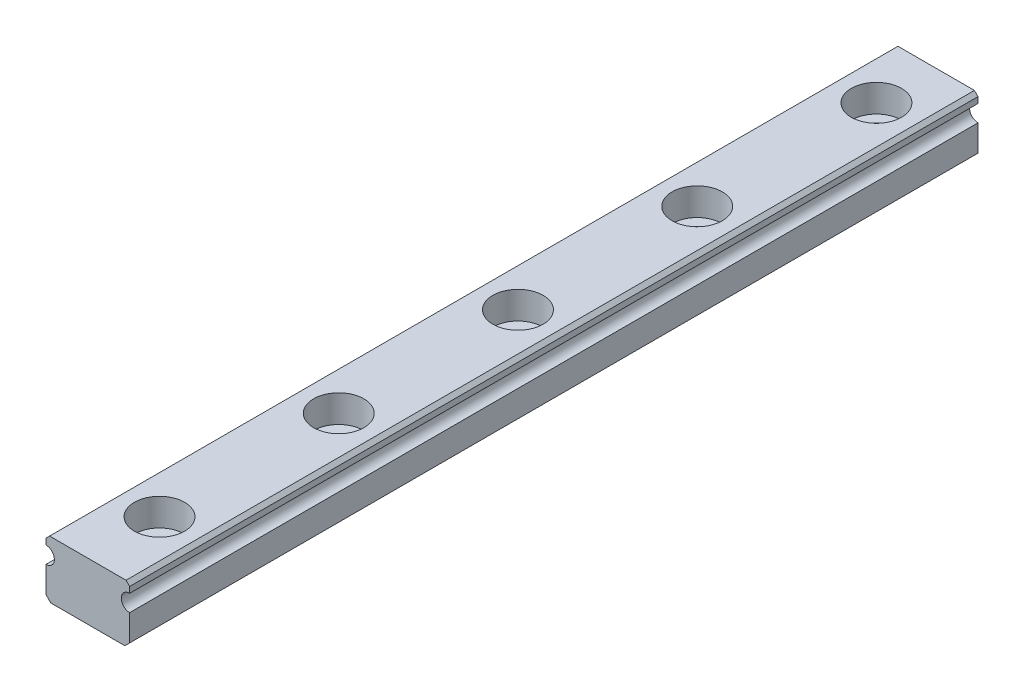
ISO-10303-21;
HEADER;
FILE_DESCRIPTION(('STEP AP214'),'2;1');
FILE_NAME('part.step','',(''),(''),'','','');
FILE_SCHEMA(('AUTOMOTIVE_DESIGN { 1 0 10303 214 1 1 1 1 }'));
ENDSEC;
DATA;
#1=APPLICATION_CONTEXT('core data for automotive mechanical design processes');
#2=APPLICATION_PROTOCOL_DEFINITION('international standard','automotive_design',2000,#1);
#3=PRODUCT_CONTEXT('',#1,'mechanical');
#4=PRODUCT('Part','Part','',(#3));
#5=PRODUCT_RELATED_PRODUCT_CATEGORY('part','',(#4));
#6=PRODUCT_DEFINITION_FORMATION('','',#4);
#7=PRODUCT_DEFINITION_CONTEXT('part definition',#1,'design');
#8=PRODUCT_DEFINITION('design','',#6,#7);
#9=PRODUCT_DEFINITION_SHAPE('','',#8);
#10=(LENGTH_UNIT() NAMED_UNIT(*) SI_UNIT(.MILLI.,.METRE.));
#11=(NAMED_UNIT(*) PLANE_ANGLE_UNIT() SI_UNIT($,.RADIAN.));
#12=(NAMED_UNIT(*) SI_UNIT($,.STERADIAN.) SOLID_ANGLE_UNIT());
#13=UNCERTAINTY_MEASURE_WITH_UNIT(LENGTH_MEASURE(1.E-05),#10,'distance_accuracy_value','');
#14=(GEOMETRIC_REPRESENTATION_CONTEXT(3) GLOBAL_UNCERTAINTY_ASSIGNED_CONTEXT((#13)) GLOBAL_UNIT_ASSIGNED_CONTEXT((#10,
#11,#12)) REPRESENTATION_CONTEXT('',''));
#15=CARTESIAN_POINT('',(0.,0.,0.));
#16=DIRECTION('',(0.,0.,1.));
#17=DIRECTION('',(1.,0.,0.));
#18=AXIS2_PLACEMENT_3D('',#15,#16,#17);
#19=CARTESIAN_POINT('',(3.5,4.,20.));
#20=DIRECTION('',(-1.,0.,0.));
#21=DIRECTION('',(0.,0.,1.));
#22=AXIS2_PLACEMENT_3D('',#19,#20,#21);
#23=PLANE('',#22);
#24=DIRECTION('',(0.,1.,0.));
#25=VECTOR('',#24,1.);
#26=CARTESIAN_POINT('',(3.5,4.,-9.));
#27=LINE('',#26,#25);
#28=CARTESIAN_POINT('',(3.5,4.,-9.));
#29=VERTEX_POINT('',#28);
#30=CARTESIAN_POINT('',(3.5,4.5,-9.));
#31=VERTEX_POINT('',#30);
#32=EDGE_CURVE('E297',#29,#31,#27,.T.);
#33=ORIENTED_EDGE('',*,*,#32,.F.);
#34=DIRECTION('',(0.,0.,-1.));
#35=VECTOR('',#34,1.);
#36=CARTESIAN_POINT('',(3.5,4.,20.));
#37=LINE('',#36,#35);
#38=CARTESIAN_POINT('',(3.5,4.,-80.));
#39=VERTEX_POINT('',#38);
#40=EDGE_CURVE('E109',#29,#39,#37,.T.);
#41=ORIENTED_EDGE('',*,*,#40,.T.);
#42=DIRECTION('',(0.,1.,0.));
#43=VECTOR('',#42,1.);
#44=CARTESIAN_POINT('',(3.5,4.,-80.));
#45=LINE('',#44,#43);
#46=CARTESIAN_POINT('',(3.5,4.5,-80.0000000000001));
#47=VERTEX_POINT('',#46);
#48=EDGE_CURVE('E121',#47,#39,#45,.F.);
#49=ORIENTED_EDGE('',*,*,#48,.F.);
#50=DIRECTION('',(0.,0.,1.));
#51=VECTOR('',#50,1.);
#52=CARTESIAN_POINT('',(3.5,4.5,20.));
#53=LINE('',#52,#51);
#54=EDGE_CURVE('E120',#47,#31,#53,.T.);
#55=ORIENTED_EDGE('',*,*,#54,.T.);
#56=EDGE_LOOP('',(#33,#41,#49,#55));
#57=FACE_BOUND('',#56,.T.);
#58=ADVANCED_FACE('F34',(#57),#23,.F.);
#59=CARTESIAN_POINT('',(-3.2,4.8,20.));
#60=DIRECTION('',(0.707106781186548,-0.707106781186547,0.));
#61=DIRECTION('',(0.707106781186547,0.707106781186548,0.));
#62=AXIS2_PLACEMENT_3D('',#59,#60,#61);
#63=PLANE('',#62);
#64=DIRECTION('',(-0.707106781186547,-0.707106781186548,0.));
#65=VECTOR('',#64,1.);
#66=CARTESIAN_POINT('',(-3.2,4.8,-9.));
#67=LINE('',#66,#65);
#68=CARTESIAN_POINT('',(-3.2,4.8,-9.));
#69=VERTEX_POINT('',#68);
#70=CARTESIAN_POINT('',(-3.5,4.5,-9.));
#71=VERTEX_POINT('',#70);
#72=EDGE_CURVE('E104',#69,#71,#67,.T.);
#73=ORIENTED_EDGE('',*,*,#72,.F.);
#74=DIRECTION('',(0.,0.,1.));
#75=VECTOR('',#74,1.);
#76=CARTESIAN_POINT('',(-3.2,4.8,20.));
#77=LINE('',#76,#75);
#78=CARTESIAN_POINT('',(-3.2,4.8,-80.));
#79=VERTEX_POINT('',#78);
#80=EDGE_CURVE('E96',#69,#79,#77,.F.);
#81=ORIENTED_EDGE('',*,*,#80,.T.);
#82=DIRECTION('',(0.707106781186547,0.707106781186548,0.));
#83=VECTOR('',#82,1.);
#84=CARTESIAN_POINT('',(-3.2,4.8,-80.));
#85=LINE('',#84,#83);
#86=CARTESIAN_POINT('',(-3.5,4.5,-80.));
#87=VERTEX_POINT('',#86);
#88=EDGE_CURVE('E100',#87,#79,#85,.T.);
#89=ORIENTED_EDGE('',*,*,#88,.F.);
#90=DIRECTION('',(0.,0.,-1.));
#91=VECTOR('',#90,1.);
#92=CARTESIAN_POINT('',(-3.5,4.5,20.));
#93=LINE('',#92,#91);
#94=EDGE_CURVE('E180',#87,#71,#93,.F.);
#95=ORIENTED_EDGE('',*,*,#94,.T.);
#96=EDGE_LOOP('',(#73,#81,#89,#95));
#97=FACE_BOUND('',#96,.T.);
#98=ADVANCED_FACE('F98',(#97),#63,.F.);
#99=CARTESIAN_POINT('',(3.5,4.5,20.));
#100=DIRECTION('',(-0.707106781186548,-0.707106781186548,0.));
#101=DIRECTION('',(0.707106781186548,-0.707106781186548,0.));
#102=AXIS2_PLACEMENT_3D('',#99,#100,#101);
#103=PLANE('',#102);
#104=DIRECTION('',(-0.707106781186548,0.707106781186548,0.));
#105=VECTOR('',#104,1.);
#106=CARTESIAN_POINT('',(3.5,4.5,-9.));
#107=LINE('',#106,#105);
#108=CARTESIAN_POINT('',(3.2,4.8,-9.));
#109=VERTEX_POINT('',#108);
#110=EDGE_CURVE('E191',#31,#109,#107,.T.);
#111=ORIENTED_EDGE('',*,*,#110,.F.);
#112=ORIENTED_EDGE('',*,*,#54,.F.);
#113=DIRECTION('',(0.707106781186548,-0.707106781186548,0.));
#114=VECTOR('',#113,1.);
#115=CARTESIAN_POINT('',(3.5,4.5,-80.0000000000001));
#116=LINE('',#115,#114);
#117=CARTESIAN_POINT('',(3.2,4.8,-80.));
#118=VERTEX_POINT('',#117);
#119=EDGE_CURVE('E181',#118,#47,#116,.T.);
#120=ORIENTED_EDGE('',*,*,#119,.F.);
#121=DIRECTION('',(0.,0.,1.));
#122=VECTOR('',#121,1.);
#123=CARTESIAN_POINT('',(3.2,4.8,20.));
#124=LINE('',#123,#122);
#125=EDGE_CURVE('E108',#118,#109,#124,.T.);
#126=ORIENTED_EDGE('',*,*,#125,.T.);
#127=EDGE_LOOP('',(#111,#112,#120,#126));
#128=FACE_BOUND('',#127,.T.);
#129=ADVANCED_FACE('F310',(#128),#103,.F.);
#130=CARTESIAN_POINT('',(-3.5,4.8,20.));
#131=DIRECTION('',(1.,0.,0.));
#132=DIRECTION('',(0.,0.,-1.));
#133=AXIS2_PLACEMENT_3D('',#130,#131,#132);
#134=PLANE('',#133);
#135=DIRECTION('',(0.,-1.,0.));
#136=VECTOR('',#135,1.);
#137=CARTESIAN_POINT('',(-3.5,4.8,-9.));
#138=LINE('',#137,#136);
#139=CARTESIAN_POINT('',(-3.5,4.,-9.));
#140=VERTEX_POINT('',#139);
#141=EDGE_CURVE('E291',#71,#140,#138,.T.);
#142=ORIENTED_EDGE('',*,*,#141,.F.);
#143=ORIENTED_EDGE('',*,*,#94,.F.);
#144=DIRECTION('',(0.,1.,0.));
#145=VECTOR('',#144,1.);
#146=CARTESIAN_POINT('',(-3.5,4.8,-80.));
#147=LINE('',#146,#145);
#148=CARTESIAN_POINT('',(-3.5,4.,-80.));
#149=VERTEX_POINT('',#148);
#150=EDGE_CURVE('E119',#149,#87,#147,.T.);
#151=ORIENTED_EDGE('',*,*,#150,.F.);
#152=DIRECTION('',(0.,0.,-1.));
#153=VECTOR('',#152,1.);
#154=CARTESIAN_POINT('',(-3.5,4.,20.));
#155=LINE('',#154,#153);
#156=EDGE_CURVE('E156',#149,#140,#155,.F.);
#157=ORIENTED_EDGE('',*,*,#156,.T.);
#158=EDGE_LOOP('',(#142,#143,#151,#157));
#159=FACE_BOUND('',#158,.T.);
#160=ADVANCED_FACE('F335',(#159),#134,.F.);
#161=CARTESIAN_POINT('',(3.5,0.,20.));
#162=DIRECTION('',(-1.,0.,0.));
#163=DIRECTION('',(0.,0.,1.));
#164=AXIS2_PLACEMENT_3D('',#161,#162,#163);
#165=PLANE('',#164);
#166=DIRECTION('',(0.,1.,0.));
#167=VECTOR('',#166,1.);
#168=CARTESIAN_POINT('',(3.5,0.,-9.));
#169=LINE('',#168,#167);
#170=CARTESIAN_POINT('',(3.5,0.4,-9.));
#171=VERTEX_POINT('',#170);
#172=CARTESIAN_POINT('',(3.5,2.6,-9.));
#173=VERTEX_POINT('',#172);
#174=EDGE_CURVE('E283',#171,#173,#169,.T.);
#175=ORIENTED_EDGE('',*,*,#174,.F.);
#176=DIRECTION('',(0.,0.,1.));
#177=VECTOR('',#176,1.);
#178=CARTESIAN_POINT('',(3.5,0.4,20.));
#179=LINE('',#178,#177);
#180=CARTESIAN_POINT('',(3.5,0.4,-80.));
#181=VERTEX_POINT('',#180);
#182=EDGE_CURVE('E37',#171,#181,#179,.F.);
#183=ORIENTED_EDGE('',*,*,#182,.T.);
#184=DIRECTION('',(0.,1.,0.));
#185=VECTOR('',#184,1.);
#186=CARTESIAN_POINT('',(3.5,2.41899298511882,-80.));
#187=LINE('',#186,#185);
#188=CARTESIAN_POINT('',(3.5,2.6,-80.));
#189=VERTEX_POINT('',#188);
#190=EDGE_CURVE('E133',#181,#189,#187,.T.);
#191=ORIENTED_EDGE('',*,*,#190,.T.);
#192=DIRECTION('',(0.,0.,-1.));
#193=VECTOR('',#192,1.);
#194=CARTESIAN_POINT('',(3.5,2.6,20.));
#195=LINE('',#194,#193);
#196=EDGE_CURVE('E195',#189,#173,#195,.F.);
#197=ORIENTED_EDGE('',*,*,#196,.T.);
#198=EDGE_LOOP('',(#175,#183,#191,#197));
#199=FACE_BOUND('',#198,.T.);
#200=ADVANCED_FACE('F322',(#199),#165,.F.);
#201=CARTESIAN_POINT('',(3.5,3.3,20.));
#202=DIRECTION('',(0.,0.,-1.));
#203=DIRECTION('',(-1.,0.,0.));
#204=AXIS2_PLACEMENT_3D('',#201,#202,#203);
#205=CYLINDRICAL_SURFACE('',#204,0.7);
#206=CARTESIAN_POINT('',(3.5,3.3,-9.));
#207=DIRECTION('',(0.,0.,1.));
#208=DIRECTION('',(1.,0.,0.));
#209=AXIS2_PLACEMENT_3D('',#206,#207,#208);
#210=CIRCLE('',#209,0.7);
#211=EDGE_CURVE('E295',#173,#29,#210,.F.);
#212=ORIENTED_EDGE('',*,*,#211,.F.);
#213=ORIENTED_EDGE('',*,*,#196,.F.);
#214=CARTESIAN_POINT('',(3.5,3.3,-80.));
#215=DIRECTION('',(0.,0.,-1.));
#216=DIRECTION('',(-1.,0.,0.));
#217=AXIS2_PLACEMENT_3D('',#214,#215,#216);
#218=CIRCLE('',#217,0.7);
#219=EDGE_CURVE('E127',#189,#39,#218,.T.);
#220=ORIENTED_EDGE('',*,*,#219,.T.);
#221=ORIENTED_EDGE('',*,*,#40,.F.);
#222=EDGE_LOOP('',(#212,#213,#220,#221));
#223=FACE_BOUND('',#222,.T.);
#224=ADVANCED_FACE('F317',(#223),#205,.F.);
#225=CARTESIAN_POINT('',(3.5,4.8,20.));
#226=DIRECTION('',(0.,-1.,0.));
#227=DIRECTION('',(0.,0.,-1.));
#228=AXIS2_PLACEMENT_3D('',#225,#226,#227);
#229=PLANE('',#228);
#230=CARTESIAN_POINT('',(0.,4.8,-15.));
#231=DIRECTION('',(0.,1.,0.));
#232=DIRECTION('',(0.,0.,1.));
#233=AXIS2_PLACEMENT_3D('',#230,#231,#232);
#234=CIRCLE('',#233,2.1);
#235=CARTESIAN_POINT('',(0.,4.8,-12.9));
#236=VERTEX_POINT('',#235);
#237=EDGE_CURVE('E166',#236,#236,#234,.T.);
#238=ORIENTED_EDGE('',*,*,#237,.F.);
#239=EDGE_LOOP('',(#238));
#240=FACE_BOUND('',#239,.T.);
#241=CARTESIAN_POINT('',(0.,4.8,-75.));
#242=DIRECTION('',(0.,1.,0.));
#243=DIRECTION('',(0.,0.,1.));
#244=AXIS2_PLACEMENT_3D('',#241,#242,#243);
#245=CIRCLE('',#244,2.1);
#246=CARTESIAN_POINT('',(0.,4.8,-72.9));
#247=VERTEX_POINT('',#246);
#248=EDGE_CURVE('E163',#247,#247,#245,.T.);
#249=ORIENTED_EDGE('',*,*,#248,.F.);
#250=EDGE_LOOP('',(#249));
#251=FACE_BOUND('',#250,.T.);
#252=CARTESIAN_POINT('',(0.,4.8,-60.));
#253=DIRECTION('',(0.,1.,0.));
#254=DIRECTION('',(0.,0.,1.));
#255=AXIS2_PLACEMENT_3D('',#252,#253,#254);
#256=CIRCLE('',#255,2.1);
#257=CARTESIAN_POINT('',(0.,4.8,-57.9));
#258=VERTEX_POINT('',#257);
#259=EDGE_CURVE('E160',#258,#258,#256,.T.);
#260=ORIENTED_EDGE('',*,*,#259,.F.);
#261=EDGE_LOOP('',(#260));
#262=FACE_BOUND('',#261,.T.);
#263=CARTESIAN_POINT('',(0.,4.8,-45.));
#264=DIRECTION('',(0.,1.,0.));
#265=DIRECTION('',(0.,0.,1.));
#266=AXIS2_PLACEMENT_3D('',#263,#264,#265);
#267=CIRCLE('',#266,2.1);
#268=CARTESIAN_POINT('',(0.,4.8,-42.9));
#269=VERTEX_POINT('',#268);
#270=EDGE_CURVE('E157',#269,#269,#267,.T.);
#271=ORIENTED_EDGE('',*,*,#270,.F.);
#272=EDGE_LOOP('',(#271));
#273=FACE_BOUND('',#272,.T.);
#274=CARTESIAN_POINT('',(0.,4.8,-30.));
#275=DIRECTION('',(0.,1.,0.));
#276=DIRECTION('',(0.,0.,1.));
#277=AXIS2_PLACEMENT_3D('',#274,#275,#276);
#278=CIRCLE('',#277,2.1);
#279=CARTESIAN_POINT('',(0.,4.8,-27.9));
#280=VERTEX_POINT('',#279);
#281=EDGE_CURVE('E153',#280,#280,#278,.T.);
#282=ORIENTED_EDGE('',*,*,#281,.F.);
#283=EDGE_LOOP('',(#282));
#284=FACE_BOUND('',#283,.T.);
#285=DIRECTION('',(-1.,0.,0.));
#286=VECTOR('',#285,1.);
#287=CARTESIAN_POINT('',(3.68743961311784,4.8,-9.));
#288=LINE('',#287,#286);
#289=EDGE_CURVE('E305',#109,#69,#288,.T.);
#290=ORIENTED_EDGE('',*,*,#289,.F.);
#291=ORIENTED_EDGE('',*,*,#125,.F.);
#292=DIRECTION('',(1.,0.,0.));
#293=VECTOR('',#292,1.);
#294=CARTESIAN_POINT('',(3.5,4.8,-80.));
#295=LINE('',#294,#293);
#296=EDGE_CURVE('E117',#118,#79,#295,.F.);
#297=ORIENTED_EDGE('',*,*,#296,.T.);
#298=ORIENTED_EDGE('',*,*,#80,.F.);
#299=EDGE_LOOP('',(#290,#291,#297,#298));
#300=FACE_BOUND('',#299,.T.);
#301=ADVANCED_FACE('F124',(#240,#251,#262,#273,#284,#300),#229,.F.);
#302=CARTESIAN_POINT('',(-3.5,3.3,20.));
#303=DIRECTION('',(0.,0.,-1.));
#304=DIRECTION('',(-1.,0.,0.));
#305=AXIS2_PLACEMENT_3D('',#302,#303,#304);
#306=CYLINDRICAL_SURFACE('',#305,0.7);
#307=CARTESIAN_POINT('',(-3.5,3.3,-9.));
#308=DIRECTION('',(0.,0.,1.));
#309=DIRECTION('',(1.,0.,0.));
#310=AXIS2_PLACEMENT_3D('',#307,#308,#309);
#311=CIRCLE('',#310,0.7);
#312=CARTESIAN_POINT('',(-3.5,2.6,-9.));
#313=VERTEX_POINT('',#312);
#314=EDGE_CURVE('E273',#140,#313,#311,.F.);
#315=ORIENTED_EDGE('',*,*,#314,.F.);
#316=ORIENTED_EDGE('',*,*,#156,.F.);
#317=CARTESIAN_POINT('',(-3.5,3.3,-80.));
#318=DIRECTION('',(0.,0.,-1.));
#319=DIRECTION('',(-1.,0.,0.));
#320=AXIS2_PLACEMENT_3D('',#317,#318,#319);
#321=CIRCLE('',#320,0.7);
#322=CARTESIAN_POINT('',(-3.5,2.6,-80.));
#323=VERTEX_POINT('',#322);
#324=EDGE_CURVE('E126',#149,#323,#321,.T.);
#325=ORIENTED_EDGE('',*,*,#324,.T.);
#326=DIRECTION('',(0.,0.,-1.));
#327=VECTOR('',#326,1.);
#328=CARTESIAN_POINT('',(-3.5,2.6,20.));
#329=LINE('',#328,#327);
#330=EDGE_CURVE('E152',#323,#313,#329,.F.);
#331=ORIENTED_EDGE('',*,*,#330,.T.);
#332=EDGE_LOOP('',(#315,#316,#325,#331));
#333=FACE_BOUND('',#332,.T.);
#334=ADVANCED_FACE('F269',(#333),#306,.F.);
#335=CARTESIAN_POINT('',(-3.5,2.6,20.));
#336=DIRECTION('',(1.,0.,0.));
#337=DIRECTION('',(0.,0.,-1.));
#338=AXIS2_PLACEMENT_3D('',#335,#336,#337);
#339=PLANE('',#338);
#340=DIRECTION('',(0.,-1.,0.));
#341=VECTOR('',#340,1.);
#342=CARTESIAN_POINT('',(-3.5,2.6,-9.));
#343=LINE('',#342,#341);
#344=CARTESIAN_POINT('',(-3.5,0.4,-9.));
#345=VERTEX_POINT('',#344);
#346=EDGE_CURVE('E279',#313,#345,#343,.T.);
#347=ORIENTED_EDGE('',*,*,#346,.F.);
#348=ORIENTED_EDGE('',*,*,#330,.F.);
#349=DIRECTION('',(0.,1.,0.));
#350=VECTOR('',#349,1.);
#351=CARTESIAN_POINT('',(-3.5,2.41899298511882,-80.));
#352=LINE('',#351,#350);
#353=CARTESIAN_POINT('',(-3.5,0.400000000000001,-80.));
#354=VERTEX_POINT('',#353);
#355=EDGE_CURVE('E130',#323,#354,#352,.F.);
#356=ORIENTED_EDGE('',*,*,#355,.T.);
#357=DIRECTION('',(0.,0.,1.));
#358=VECTOR('',#357,1.);
#359=CARTESIAN_POINT('',(-3.5,0.4,20.));
#360=LINE('',#359,#358);
#361=EDGE_CURVE('E231',#354,#345,#360,.T.);
#362=ORIENTED_EDGE('',*,*,#361,.T.);
#363=EDGE_LOOP('',(#347,#348,#356,#362));
#364=FACE_BOUND('',#363,.T.);
#365=ADVANCED_FACE('F278',(#364),#339,.F.);
#366=CARTESIAN_POINT('',(3.1,0.,20.));
#367=DIRECTION('',(-0.707106781186548,0.707106781186547,0.));
#368=DIRECTION('',(-0.707106781186547,-0.707106781186548,0.));
#369=AXIS2_PLACEMENT_3D('',#366,#367,#368);
#370=PLANE('',#369);
#371=DIRECTION('',(0.707106781186547,0.707106781186548,0.));
#372=VECTOR('',#371,1.);
#373=CARTESIAN_POINT('',(3.1,0.,-9.));
#374=LINE('',#373,#372);
#375=CARTESIAN_POINT('',(3.1,0.,-9.));
#376=VERTEX_POINT('',#375);
#377=EDGE_CURVE('E281',#376,#171,#374,.T.);
#378=ORIENTED_EDGE('',*,*,#377,.F.);
#379=DIRECTION('',(0.,0.,1.));
#380=VECTOR('',#379,1.);
#381=CARTESIAN_POINT('',(3.1,0.,20.));
#382=LINE('',#381,#380);
#383=CARTESIAN_POINT('',(3.1,0.,-80.));
#384=VERTEX_POINT('',#383);
#385=EDGE_CURVE('E170',#376,#384,#382,.F.);
#386=ORIENTED_EDGE('',*,*,#385,.T.);
#387=DIRECTION('',(0.707106781186547,0.707106781186548,0.));
#388=VECTOR('',#387,1.);
#389=CARTESIAN_POINT('',(3.1,0.,-80.));
#390=LINE('',#389,#388);
#391=EDGE_CURVE('E246',#384,#181,#390,.T.);
#392=ORIENTED_EDGE('',*,*,#391,.T.);
#393=ORIENTED_EDGE('',*,*,#182,.F.);
#394=EDGE_LOOP('',(#378,#386,#392,#393));
#395=FACE_BOUND('',#394,.T.);
#396=ADVANCED_FACE('F374',(#395),#370,.F.);
#397=CARTESIAN_POINT('',(-3.5,0.4,20.));
#398=DIRECTION('',(0.707106781186547,0.707106781186548,0.));
#399=DIRECTION('',(-0.707106781186548,0.707106781186547,0.));
#400=AXIS2_PLACEMENT_3D('',#397,#398,#399);
#401=PLANE('',#400);
#402=DIRECTION('',(0.707106781186548,-0.707106781186547,0.));
#403=VECTOR('',#402,1.);
#404=CARTESIAN_POINT('',(-3.5,0.4,-9.));
#405=LINE('',#404,#403);
#406=CARTESIAN_POINT('',(-3.1,0.,-9.));
#407=VERTEX_POINT('',#406);
#408=EDGE_CURVE('E49',#345,#407,#405,.T.);
#409=ORIENTED_EDGE('',*,*,#408,.F.);
#410=ORIENTED_EDGE('',*,*,#361,.F.);
#411=DIRECTION('',(-0.707106781186548,0.707106781186547,0.));
#412=VECTOR('',#411,1.);
#413=CARTESIAN_POINT('',(-3.5,0.4,-80.));
#414=LINE('',#413,#412);
#415=CARTESIAN_POINT('',(-3.1,0.,-80.));
#416=VERTEX_POINT('',#415);
#417=EDGE_CURVE('E58',#416,#354,#414,.T.);
#418=ORIENTED_EDGE('',*,*,#417,.F.);
#419=DIRECTION('',(0.,0.,1.));
#420=VECTOR('',#419,1.);
#421=CARTESIAN_POINT('',(-3.1,0.,20.));
#422=LINE('',#421,#420);
#423=EDGE_CURVE('E216',#416,#407,#422,.T.);
#424=ORIENTED_EDGE('',*,*,#423,.T.);
#425=EDGE_LOOP('',(#409,#410,#418,#424));
#426=FACE_BOUND('',#425,.T.);
#427=ADVANCED_FACE('F395',(#426),#401,.F.);
#428=CARTESIAN_POINT('',(0.8,0.,20.));
#429=DIRECTION('',(0.,1.,0.));
#430=DIRECTION('',(0.,0.,1.));
#431=AXIS2_PLACEMENT_3D('',#428,#429,#430);
#432=PLANE('',#431);
#433=CARTESIAN_POINT('',(0.,0.,-15.));
#434=DIRECTION('',(0.,1.,0.));
#435=DIRECTION('',(0.,0.,1.));
#436=AXIS2_PLACEMENT_3D('',#433,#434,#435);
#437=CIRCLE('',#436,1.2);
#438=CARTESIAN_POINT('',(0.,0.,-13.8));
#439=VERTEX_POINT('',#438);
#440=EDGE_CURVE('E213',#439,#439,#437,.F.);
#441=ORIENTED_EDGE('',*,*,#440,.F.);
#442=EDGE_LOOP('',(#441));
#443=FACE_BOUND('',#442,.T.);
#444=CARTESIAN_POINT('',(0.,0.,-75.));
#445=DIRECTION('',(0.,1.,0.));
#446=DIRECTION('',(0.,0.,1.));
#447=AXIS2_PLACEMENT_3D('',#444,#445,#446);
#448=CIRCLE('',#447,1.2);
#449=CARTESIAN_POINT('',(0.,0.,-73.8));
#450=VERTEX_POINT('',#449);
#451=EDGE_CURVE('E210',#450,#450,#448,.F.);
#452=ORIENTED_EDGE('',*,*,#451,.F.);
#453=EDGE_LOOP('',(#452));
#454=FACE_BOUND('',#453,.T.);
#455=CARTESIAN_POINT('',(0.,0.,-60.));
#456=DIRECTION('',(0.,1.,0.));
#457=DIRECTION('',(0.,0.,1.));
#458=AXIS2_PLACEMENT_3D('',#455,#456,#457);
#459=CIRCLE('',#458,1.2);
#460=CARTESIAN_POINT('',(0.,0.,-58.8));
#461=VERTEX_POINT('',#460);
#462=EDGE_CURVE('E207',#461,#461,#459,.F.);
#463=ORIENTED_EDGE('',*,*,#462,.F.);
#464=EDGE_LOOP('',(#463));
#465=FACE_BOUND('',#464,.T.);
#466=CARTESIAN_POINT('',(0.,0.,-45.));
#467=DIRECTION('',(0.,1.,0.));
#468=DIRECTION('',(0.,0.,1.));
#469=AXIS2_PLACEMENT_3D('',#466,#467,#468);
#470=CIRCLE('',#469,1.2);
#471=CARTESIAN_POINT('',(0.,0.,-43.8));
#472=VERTEX_POINT('',#471);
#473=EDGE_CURVE('E204',#472,#472,#470,.F.);
#474=ORIENTED_EDGE('',*,*,#473,.F.);
#475=EDGE_LOOP('',(#474));
#476=FACE_BOUND('',#475,.T.);
#477=CARTESIAN_POINT('',(0.,0.,-30.));
#478=DIRECTION('',(0.,1.,0.));
#479=DIRECTION('',(0.,0.,1.));
#480=AXIS2_PLACEMENT_3D('',#477,#478,#479);
#481=CIRCLE('',#480,1.2);
#482=CARTESIAN_POINT('',(0.,0.,-28.8));
#483=VERTEX_POINT('',#482);
#484=EDGE_CURVE('E43',#483,#483,#481,.F.);
#485=ORIENTED_EDGE('',*,*,#484,.F.);
#486=EDGE_LOOP('',(#485));
#487=FACE_BOUND('',#486,.T.);
#488=DIRECTION('',(1.,0.,0.));
#489=VECTOR('',#488,1.);
#490=CARTESIAN_POINT('',(0.8,0.,-9.));
#491=LINE('',#490,#489);
#492=EDGE_CURVE('E11',#407,#376,#491,.T.);
#493=ORIENTED_EDGE('',*,*,#492,.F.);
#494=ORIENTED_EDGE('',*,*,#423,.F.);
#495=DIRECTION('',(1.,0.,0.));
#496=VECTOR('',#495,1.);
#497=CARTESIAN_POINT('',(0.8,0.,-80.));
#498=LINE('',#497,#496);
#499=EDGE_CURVE('E172',#384,#416,#498,.F.);
#500=ORIENTED_EDGE('',*,*,#499,.F.);
#501=ORIENTED_EDGE('',*,*,#385,.F.);
#502=EDGE_LOOP('',(#493,#494,#500,#501));
#503=FACE_BOUND('',#502,.T.);
#504=ADVANCED_FACE('F345',(#443,#454,#465,#476,#487,#503),#432,.F.);
#505=CARTESIAN_POINT('',(0.,3.65,-15.));
#506=DIRECTION('',(0.,1.,0.));
#507=DIRECTION('',(0.,0.,1.));
#508=AXIS2_PLACEMENT_3D('',#505,#506,#507);
#509=CYLINDRICAL_SURFACE('',#508,2.1);
#510=ORIENTED_EDGE('',*,*,#237,.T.);
#511=EDGE_LOOP('',(#510));
#512=FACE_BOUND('',#511,.T.);
#513=CARTESIAN_POINT('',(0.,2.5,-15.));
#514=DIRECTION('',(0.,1.,0.));
#515=DIRECTION('',(0.,0.,1.));
#516=AXIS2_PLACEMENT_3D('',#513,#514,#515);
#517=CIRCLE('',#516,2.1);
#518=CARTESIAN_POINT('',(0.,2.5,-12.9));
#519=VERTEX_POINT('',#518);
#520=EDGE_CURVE('E149',#519,#519,#517,.T.);
#521=ORIENTED_EDGE('',*,*,#520,.F.);
#522=EDGE_LOOP('',(#521));
#523=FACE_BOUND('',#522,.T.);
#524=ADVANCED_FACE('F341',(#512,#523),#509,.F.);
#525=CARTESIAN_POINT('',(0.,3.65,-75.));
#526=DIRECTION('',(0.,1.,0.));
#527=DIRECTION('',(0.,0.,1.));
#528=AXIS2_PLACEMENT_3D('',#525,#526,#527);
#529=CYLINDRICAL_SURFACE('',#528,2.1);
#530=ORIENTED_EDGE('',*,*,#248,.T.);
#531=EDGE_LOOP('',(#530));
#532=FACE_BOUND('',#531,.T.);
#533=CARTESIAN_POINT('',(0.,2.5,-75.));
#534=DIRECTION('',(0.,1.,0.));
#535=DIRECTION('',(0.,0.,1.));
#536=AXIS2_PLACEMENT_3D('',#533,#534,#535);
#537=CIRCLE('',#536,2.1);
#538=CARTESIAN_POINT('',(0.,2.5,-72.9));
#539=VERTEX_POINT('',#538);
#540=EDGE_CURVE('E146',#539,#539,#537,.T.);
#541=ORIENTED_EDGE('',*,*,#540,.F.);
#542=EDGE_LOOP('',(#541));
#543=FACE_BOUND('',#542,.T.);
#544=ADVANCED_FACE('F344',(#532,#543),#529,.F.);
#545=CARTESIAN_POINT('',(0.,3.65,-60.));
#546=DIRECTION('',(0.,1.,0.));
#547=DIRECTION('',(0.,0.,1.));
#548=AXIS2_PLACEMENT_3D('',#545,#546,#547);
#549=CYLINDRICAL_SURFACE('',#548,2.1);
#550=ORIENTED_EDGE('',*,*,#259,.T.);
#551=EDGE_LOOP('',(#550));
#552=FACE_BOUND('',#551,.T.);
#553=CARTESIAN_POINT('',(0.,2.5,-60.));
#554=DIRECTION('',(0.,1.,0.));
#555=DIRECTION('',(0.,0.,1.));
#556=AXIS2_PLACEMENT_3D('',#553,#554,#555);
#557=CIRCLE('',#556,2.1);
#558=CARTESIAN_POINT('',(0.,2.5,-57.9));
#559=VERTEX_POINT('',#558);
#560=EDGE_CURVE('E143',#559,#559,#557,.T.);
#561=ORIENTED_EDGE('',*,*,#560,.F.);
#562=EDGE_LOOP('',(#561));
#563=FACE_BOUND('',#562,.T.);
#564=ADVANCED_FACE('F349',(#552,#563),#549,.F.);
#565=CARTESIAN_POINT('',(0.,3.65,-45.));
#566=DIRECTION('',(0.,1.,0.));
#567=DIRECTION('',(0.,0.,1.));
#568=AXIS2_PLACEMENT_3D('',#565,#566,#567);
#569=CYLINDRICAL_SURFACE('',#568,2.1);
#570=ORIENTED_EDGE('',*,*,#270,.T.);
#571=EDGE_LOOP('',(#570));
#572=FACE_BOUND('',#571,.T.);
#573=CARTESIAN_POINT('',(0.,2.5,-45.));
#574=DIRECTION('',(0.,1.,0.));
#575=DIRECTION('',(0.,0.,1.));
#576=AXIS2_PLACEMENT_3D('',#573,#574,#575);
#577=CIRCLE('',#576,2.1);
#578=CARTESIAN_POINT('',(0.,2.5,-42.9));
#579=VERTEX_POINT('',#578);
#580=EDGE_CURVE('E140',#579,#579,#577,.T.);
#581=ORIENTED_EDGE('',*,*,#580,.F.);
#582=EDGE_LOOP('',(#581));
#583=FACE_BOUND('',#582,.T.);
#584=ADVANCED_FACE('F353',(#572,#583),#569,.F.);
#585=CARTESIAN_POINT('',(0.,3.65,-30.));
#586=DIRECTION('',(0.,1.,0.));
#587=DIRECTION('',(0.,0.,1.));
#588=AXIS2_PLACEMENT_3D('',#585,#586,#587);
#589=CYLINDRICAL_SURFACE('',#588,2.1);
#590=ORIENTED_EDGE('',*,*,#281,.T.);
#591=EDGE_LOOP('',(#590));
#592=FACE_BOUND('',#591,.T.);
#593=CARTESIAN_POINT('',(0.,2.5,-30.));
#594=DIRECTION('',(0.,1.,0.));
#595=DIRECTION('',(0.,0.,1.));
#596=AXIS2_PLACEMENT_3D('',#593,#594,#595);
#597=CIRCLE('',#596,2.1);
#598=CARTESIAN_POINT('',(0.,2.5,-27.9));
#599=VERTEX_POINT('',#598);
#600=EDGE_CURVE('E137',#599,#599,#597,.T.);
#601=ORIENTED_EDGE('',*,*,#600,.F.);
#602=EDGE_LOOP('',(#601));
#603=FACE_BOUND('',#602,.T.);
#604=ADVANCED_FACE('F357',(#592,#603),#589,.F.);
#605=CARTESIAN_POINT('',(0.,2.5,-15.));
#606=DIRECTION('',(0.,1.,0.));
#607=DIRECTION('',(0.,0.,1.));
#608=AXIS2_PLACEMENT_3D('',#605,#606,#607);
#609=PLANE('',#608);
#610=CARTESIAN_POINT('',(0.,2.5,-15.));
#611=DIRECTION('',(0.,1.,0.));
#612=DIRECTION('',(0.,0.,1.));
#613=AXIS2_PLACEMENT_3D('',#610,#611,#612);
#614=CIRCLE('',#613,1.2);
#615=CARTESIAN_POINT('',(0.,2.5,-13.8));
#616=VERTEX_POINT('',#615);
#617=EDGE_CURVE('E227',#616,#616,#614,.F.);
#618=ORIENTED_EDGE('',*,*,#617,.T.);
#619=EDGE_LOOP('',(#618));
#620=FACE_BOUND('',#619,.T.);
#621=ORIENTED_EDGE('',*,*,#520,.T.);
#622=EDGE_LOOP('',(#621));
#623=FACE_BOUND('',#622,.T.);
#624=ADVANCED_FACE('F361',(#620,#623),#609,.T.);
#625=CARTESIAN_POINT('',(0.,2.5,-75.));
#626=DIRECTION('',(0.,1.,0.));
#627=DIRECTION('',(0.,0.,1.));
#628=AXIS2_PLACEMENT_3D('',#625,#626,#627);
#629=PLANE('',#628);
#630=CARTESIAN_POINT('',(0.,2.5,-75.));
#631=DIRECTION('',(0.,1.,0.));
#632=DIRECTION('',(0.,0.,1.));
#633=AXIS2_PLACEMENT_3D('',#630,#631,#632);
#634=CIRCLE('',#633,1.2);
#635=CARTESIAN_POINT('',(0.,2.5,-73.8));
#636=VERTEX_POINT('',#635);
#637=EDGE_CURVE('E225',#636,#636,#634,.F.);
#638=ORIENTED_EDGE('',*,*,#637,.T.);
#639=EDGE_LOOP('',(#638));
#640=FACE_BOUND('',#639,.T.);
#641=ORIENTED_EDGE('',*,*,#540,.T.);
#642=EDGE_LOOP('',(#641));
#643=FACE_BOUND('',#642,.T.);
#644=ADVANCED_FACE('F377',(#640,#643),#629,.T.);
#645=CARTESIAN_POINT('',(0.,2.5,-60.));
#646=DIRECTION('',(0.,1.,0.));
#647=DIRECTION('',(0.,0.,1.));
#648=AXIS2_PLACEMENT_3D('',#645,#646,#647);
#649=PLANE('',#648);
#650=CARTESIAN_POINT('',(0.,2.5,-60.));
#651=DIRECTION('',(0.,1.,0.));
#652=DIRECTION('',(0.,0.,1.));
#653=AXIS2_PLACEMENT_3D('',#650,#651,#652);
#654=CIRCLE('',#653,1.2);
#655=CARTESIAN_POINT('',(0.,2.5,-58.8));
#656=VERTEX_POINT('',#655);
#657=EDGE_CURVE('E222',#656,#656,#654,.F.);
#658=ORIENTED_EDGE('',*,*,#657,.T.);
#659=EDGE_LOOP('',(#658));
#660=FACE_BOUND('',#659,.T.);
#661=ORIENTED_EDGE('',*,*,#560,.T.);
#662=EDGE_LOOP('',(#661));
#663=FACE_BOUND('',#662,.T.);
#664=ADVANCED_FACE('F380',(#660,#663),#649,.T.);
#665=CARTESIAN_POINT('',(0.,2.5,-45.));
#666=DIRECTION('',(0.,1.,0.));
#667=DIRECTION('',(0.,0.,1.));
#668=AXIS2_PLACEMENT_3D('',#665,#666,#667);
#669=PLANE('',#668);
#670=CARTESIAN_POINT('',(0.,2.5,-45.));
#671=DIRECTION('',(0.,1.,0.));
#672=DIRECTION('',(0.,0.,1.));
#673=AXIS2_PLACEMENT_3D('',#670,#671,#672);
#674=CIRCLE('',#673,1.2);
#675=CARTESIAN_POINT('',(0.,2.5,-43.8));
#676=VERTEX_POINT('',#675);
#677=EDGE_CURVE('E219',#676,#676,#674,.F.);
#678=ORIENTED_EDGE('',*,*,#677,.T.);
#679=EDGE_LOOP('',(#678));
#680=FACE_BOUND('',#679,.T.);
#681=ORIENTED_EDGE('',*,*,#580,.T.);
#682=EDGE_LOOP('',(#681));
#683=FACE_BOUND('',#682,.T.);
#684=ADVANCED_FACE('F384',(#680,#683),#669,.T.);
#685=CARTESIAN_POINT('',(0.,2.5,-30.));
#686=DIRECTION('',(0.,1.,0.));
#687=DIRECTION('',(0.,0.,1.));
#688=AXIS2_PLACEMENT_3D('',#685,#686,#687);
#689=PLANE('',#688);
#690=CARTESIAN_POINT('',(0.,2.5,-30.));
#691=DIRECTION('',(0.,1.,0.));
#692=DIRECTION('',(0.,0.,1.));
#693=AXIS2_PLACEMENT_3D('',#690,#691,#692);
#694=CIRCLE('',#693,1.2);
#695=CARTESIAN_POINT('',(0.,2.5,-28.8));
#696=VERTEX_POINT('',#695);
#697=EDGE_CURVE('E173',#696,#696,#694,.F.);
#698=ORIENTED_EDGE('',*,*,#697,.T.);
#699=EDGE_LOOP('',(#698));
#700=FACE_BOUND('',#699,.T.);
#701=ORIENTED_EDGE('',*,*,#600,.T.);
#702=EDGE_LOOP('',(#701));
#703=FACE_BOUND('',#702,.T.);
#704=ADVANCED_FACE('F388',(#700,#703),#689,.T.);
#705=CARTESIAN_POINT('',(0.,2.41899298511882,-80.));
#706=DIRECTION('',(0.,0.,1.));
#707=DIRECTION('',(1.,0.,0.));
#708=AXIS2_PLACEMENT_3D('',#705,#706,#707);
#709=PLANE('',#708);
#710=ORIENTED_EDGE('',*,*,#355,.F.);
#711=ORIENTED_EDGE('',*,*,#324,.F.);
#712=ORIENTED_EDGE('',*,*,#150,.T.);
#713=ORIENTED_EDGE('',*,*,#88,.T.);
#714=ORIENTED_EDGE('',*,*,#296,.F.);
#715=ORIENTED_EDGE('',*,*,#119,.T.);
#716=ORIENTED_EDGE('',*,*,#48,.T.);
#717=ORIENTED_EDGE('',*,*,#219,.F.);
#718=ORIENTED_EDGE('',*,*,#190,.F.);
#719=ORIENTED_EDGE('',*,*,#391,.F.);
#720=ORIENTED_EDGE('',*,*,#499,.T.);
#721=ORIENTED_EDGE('',*,*,#417,.T.);
#722=EDGE_LOOP('',(#710,#711,#712,#713,#714,#715,#716,#717,#718,#719,#720,#721));
#723=FACE_BOUND('',#722,.T.);
#724=ADVANCED_FACE('F115',(#723),#709,.F.);
#725=CARTESIAN_POINT('',(0.,-95.559553606022,-15.));
#726=DIRECTION('',(0.,1.,0.));
#727=DIRECTION('',(0.,0.,1.));
#728=AXIS2_PLACEMENT_3D('',#725,#726,#727);
#729=CYLINDRICAL_SURFACE('',#728,1.2);
#730=ORIENTED_EDGE('',*,*,#617,.F.);
#731=EDGE_LOOP('',(#730));
#732=FACE_BOUND('',#731,.T.);
#733=ORIENTED_EDGE('',*,*,#440,.T.);
#734=EDGE_LOOP('',(#733));
#735=FACE_BOUND('',#734,.T.);
#736=ADVANCED_FACE('F399',(#732,#735),#729,.F.);
#737=CARTESIAN_POINT('',(0.,-95.559553606022,-75.));
#738=DIRECTION('',(0.,1.,0.));
#739=DIRECTION('',(0.,0.,1.));
#740=AXIS2_PLACEMENT_3D('',#737,#738,#739);
#741=CYLINDRICAL_SURFACE('',#740,1.2);
#742=ORIENTED_EDGE('',*,*,#637,.F.);
#743=EDGE_LOOP('',(#742));
#744=FACE_BOUND('',#743,.T.);
#745=ORIENTED_EDGE('',*,*,#451,.T.);
#746=EDGE_LOOP('',(#745));
#747=FACE_BOUND('',#746,.T.);
#748=ADVANCED_FACE('F404',(#744,#747),#741,.F.);
#749=CARTESIAN_POINT('',(0.,-95.559553606022,-60.));
#750=DIRECTION('',(0.,1.,0.));
#751=DIRECTION('',(0.,0.,1.));
#752=AXIS2_PLACEMENT_3D('',#749,#750,#751);
#753=CYLINDRICAL_SURFACE('',#752,1.2);
#754=ORIENTED_EDGE('',*,*,#657,.F.);
#755=EDGE_LOOP('',(#754));
#756=FACE_BOUND('',#755,.T.);
#757=ORIENTED_EDGE('',*,*,#462,.T.);
#758=EDGE_LOOP('',(#757));
#759=FACE_BOUND('',#758,.T.);
#760=ADVANCED_FACE('F408',(#756,#759),#753,.F.);
#761=CARTESIAN_POINT('',(0.,-95.559553606022,-45.));
#762=DIRECTION('',(0.,1.,0.));
#763=DIRECTION('',(0.,0.,1.));
#764=AXIS2_PLACEMENT_3D('',#761,#762,#763);
#765=CYLINDRICAL_SURFACE('',#764,1.2);
#766=ORIENTED_EDGE('',*,*,#677,.F.);
#767=EDGE_LOOP('',(#766));
#768=FACE_BOUND('',#767,.T.);
#769=ORIENTED_EDGE('',*,*,#473,.T.);
#770=EDGE_LOOP('',(#769));
#771=FACE_BOUND('',#770,.T.);
#772=ADVANCED_FACE('F412',(#768,#771),#765,.F.);
#773=CARTESIAN_POINT('',(0.,-95.559553606022,-30.));
#774=DIRECTION('',(0.,1.,0.));
#775=DIRECTION('',(0.,0.,1.));
#776=AXIS2_PLACEMENT_3D('',#773,#774,#775);
#777=CYLINDRICAL_SURFACE('',#776,1.2);
#778=ORIENTED_EDGE('',*,*,#697,.F.);
#779=EDGE_LOOP('',(#778));
#780=FACE_BOUND('',#779,.T.);
#781=ORIENTED_EDGE('',*,*,#484,.T.);
#782=EDGE_LOOP('',(#781));
#783=FACE_BOUND('',#782,.T.);
#784=ADVANCED_FACE('F416',(#780,#783),#777,.F.);
#785=CARTESIAN_POINT('',(0.,0.,-9.));
#786=DIRECTION('',(0.,0.,1.));
#787=DIRECTION('',(1.,0.,0.));
#788=AXIS2_PLACEMENT_3D('',#785,#786,#787);
#789=PLANE('',#788);
#790=ORIENTED_EDGE('',*,*,#110,.T.);
#791=ORIENTED_EDGE('',*,*,#289,.T.);
#792=ORIENTED_EDGE('',*,*,#72,.T.);
#793=ORIENTED_EDGE('',*,*,#141,.T.);
#794=ORIENTED_EDGE('',*,*,#314,.T.);
#795=ORIENTED_EDGE('',*,*,#346,.T.);
#796=ORIENTED_EDGE('',*,*,#408,.T.);
#797=ORIENTED_EDGE('',*,*,#492,.T.);
#798=ORIENTED_EDGE('',*,*,#377,.T.);
#799=ORIENTED_EDGE('',*,*,#174,.T.);
#800=ORIENTED_EDGE('',*,*,#211,.T.);
#801=ORIENTED_EDGE('',*,*,#32,.T.);
#802=EDGE_LOOP('',(#790,#791,#792,#793,#794,#795,#796,#797,#798,#799,#800,#801));
#803=FACE_BOUND('',#802,.T.);
#804=ADVANCED_FACE('F304',(#803),#789,.T.);
#805=CLOSED_SHELL('',(#58,#98,#129,#160,#200,#224,#301,#334,#365,#396,#427,#504,#524,#544,#564,
#584,#604,#624,#644,#664,#684,#704,#724,#736,#748,#760,#772,#784,#804));
#806=MANIFOLD_SOLID_BREP('B2',#805);
#807=ADVANCED_BREP_SHAPE_REPRESENTATION('',(#18,#806),#14);
#808=SHAPE_DEFINITION_REPRESENTATION(#9,#807);
ENDSEC;
END-ISO-10303-21;
